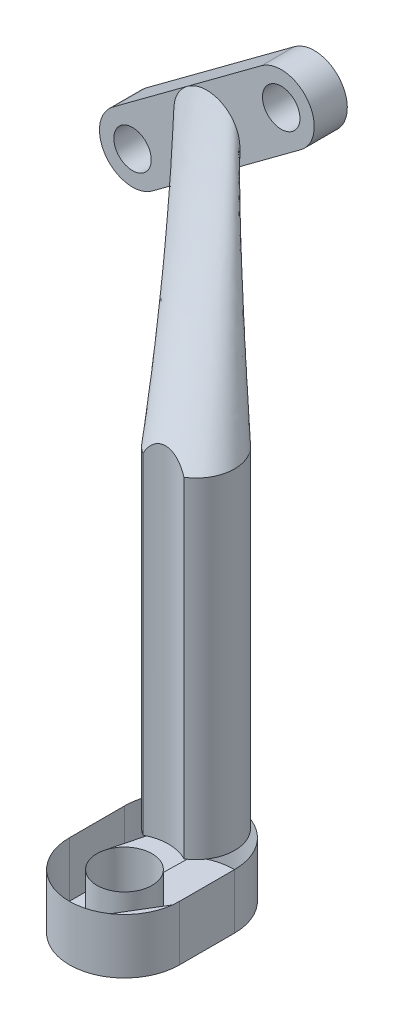
ISO-10303-21;
HEADER;
FILE_DESCRIPTION(('STEP AP214'),'2;1');
FILE_NAME('part.step','',(''),(''),'','','');
FILE_SCHEMA(('AUTOMOTIVE_DESIGN { 1 0 10303 214 1 1 1 1 }'));
ENDSEC;
DATA;
#1=APPLICATION_CONTEXT('core data for automotive mechanical design processes');
#2=APPLICATION_PROTOCOL_DEFINITION('international standard','automotive_design',2000,#1);
#3=PRODUCT_CONTEXT('',#1,'mechanical');
#4=PRODUCT('Part','Part','',(#3));
#5=PRODUCT_RELATED_PRODUCT_CATEGORY('part','',(#4));
#6=PRODUCT_DEFINITION_FORMATION('','',#4);
#7=PRODUCT_DEFINITION_CONTEXT('part definition',#1,'design');
#8=PRODUCT_DEFINITION('design','',#6,#7);
#9=PRODUCT_DEFINITION_SHAPE('','',#8);
#10=(LENGTH_UNIT() NAMED_UNIT(*) SI_UNIT(.MILLI.,.METRE.));
#11=(NAMED_UNIT(*) PLANE_ANGLE_UNIT() SI_UNIT($,.RADIAN.));
#12=(NAMED_UNIT(*) SI_UNIT($,.STERADIAN.) SOLID_ANGLE_UNIT());
#13=UNCERTAINTY_MEASURE_WITH_UNIT(LENGTH_MEASURE(1.E-05),#10,'distance_accuracy_value','');
#14=(GEOMETRIC_REPRESENTATION_CONTEXT(3) GLOBAL_UNCERTAINTY_ASSIGNED_CONTEXT((#13)) GLOBAL_UNIT_ASSIGNED_CONTEXT((#10,
#11,#12)) REPRESENTATION_CONTEXT('',''));
#15=CARTESIAN_POINT('',(0.,0.,0.));
#16=DIRECTION('',(0.,0.,1.));
#17=DIRECTION('',(1.,0.,0.));
#18=AXIS2_PLACEMENT_3D('',#15,#16,#17);
#19=CARTESIAN_POINT('',(0.,35.,-6.5));
#20=DIRECTION('',(0.,-1.,0.));
#21=DIRECTION('',(0.,0.,-1.));
#22=AXIS2_PLACEMENT_3D('',#19,#20,#21);
#23=CYLINDRICAL_SURFACE('',#22,3.5);
#24=DIRECTION('',(0.,-1.,0.));
#25=VECTOR('',#24,1.);
#26=CARTESIAN_POINT('',(-1.86528548507418,25.,-3.53846153846154));
#27=LINE('',#26,#25);
#28=CARTESIAN_POINT('',(-1.86532086672915,35.,-3.53844288912191));
#29=VERTEX_POINT('',#28);
#30=CARTESIAN_POINT('',(-1.86528548507417,5.,-3.53846153846154));
#31=VERTEX_POINT('',#30);
#32=EDGE_CURVE('E313',#29,#31,#27,.T.);
#33=ORIENTED_EDGE('',*,*,#32,.F.);
#34=CARTESIAN_POINT('',(0.,35.,-3.));
#35=CARTESIAN_POINT('',(0.291666666666667,35.,-3.));
#36=CARTESIAN_POINT('',(0.6216,35.,-3.03546666666667));
#37=CARTESIAN_POINT('',(1.3384,35.,-3.24453333333333));
#38=CARTESIAN_POINT('',(1.72666666666667,35.,-3.42));
#39=CARTESIAN_POINT('',(2.28666666666667,35.,-3.84));
#40=CARTESIAN_POINT('',(2.46884969037343,35.,-4.00597360355289));
#41=CARTESIAN_POINT('',(2.8051229123663,35.,-4.39128667041972));
#42=CARTESIAN_POINT('',(2.95905420991926,35.,-4.61072664359862));
#43=CARTESIAN_POINT('',(3.21741637831603,35.,-5.09515570934256));
#44=CARTESIAN_POINT('',(3.32161735700197,35.,-5.36011834319527));
#45=CARTESIAN_POINT('',(3.46299802761341,35.,-5.91680473372781));
#46=CARTESIAN_POINT('',(3.5,35.,-6.20833333333334));
#47=CARTESIAN_POINT('',(3.5,35.,-6.79166666666667));
#48=CARTESIAN_POINT('',(3.46299802761341,35.,-7.08319526627219));
#49=CARTESIAN_POINT('',(3.32161735700197,35.,-7.63988165680474));
#50=CARTESIAN_POINT('',(3.21741637831603,35.,-7.90484429065744));
#51=CARTESIAN_POINT('',(2.95905420991926,35.,-8.38927335640138));
#52=CARTESIAN_POINT('',(2.8051229123663,35.,-8.60871332958028));
#53=CARTESIAN_POINT('',(2.46884969037343,35.,-8.99402639644711));
#54=CARTESIAN_POINT('',(2.28666666666667,35.,-9.16));
#55=CARTESIAN_POINT('',(1.72666666666667,35.,-9.58));
#56=CARTESIAN_POINT('',(1.3384,35.,-9.75546666666667));
#57=CARTESIAN_POINT('',(0.6216,35.,-9.96453333333333));
#58=CARTESIAN_POINT('',(0.291666666666668,35.,-10.));
#59=CARTESIAN_POINT('',(-0.291666666666667,35.,-10.));
#60=CARTESIAN_POINT('',(-0.6216,35.,-9.96453333333334));
#61=CARTESIAN_POINT('',(-1.3384,35.,-9.75546666666667));
#62=CARTESIAN_POINT('',(-1.72666666666667,35.,-9.58000000000001));
#63=CARTESIAN_POINT('',(-2.28666666666667,35.,-9.16));
#64=CARTESIAN_POINT('',(-2.46884969037343,35.,-8.99402639644711));
#65=CARTESIAN_POINT('',(-2.8051229123663,35.,-8.60871332958028));
#66=CARTESIAN_POINT('',(-2.95905420991926,35.,-8.38927335640138));
#67=CARTESIAN_POINT('',(-3.21741637831603,35.,-7.90484429065744));
#68=CARTESIAN_POINT('',(-3.32161735700197,35.,-7.63988165680473));
#69=CARTESIAN_POINT('',(-3.46299802761341,35.,-7.08319526627219));
#70=CARTESIAN_POINT('',(-3.5,35.,-6.79166666666666));
#71=CARTESIAN_POINT('',(-3.5,35.,-6.20833333333333));
#72=CARTESIAN_POINT('',(-3.46299802761341,35.,-5.91680473372781));
#73=CARTESIAN_POINT('',(-3.32161735700197,35.,-5.36011834319527));
#74=CARTESIAN_POINT('',(-3.21741637831603,35.,-5.09515570934256));
#75=CARTESIAN_POINT('',(-2.95905420991926,35.,-4.61072664359862));
#76=CARTESIAN_POINT('',(-2.8051229123663,35.,-4.39128667041972));
#77=CARTESIAN_POINT('',(-2.46884969037343,35.,-4.00597360355289));
#78=CARTESIAN_POINT('',(-2.28666666666667,35.,-3.84));
#79=CARTESIAN_POINT('',(-1.72666666666667,35.,-3.42));
#80=CARTESIAN_POINT('',(-1.3384,35.,-3.24453333333334));
#81=CARTESIAN_POINT('',(-0.621600000000001,35.,-3.03546666666667));
#82=CARTESIAN_POINT('',(-0.291666666666666,35.,-3.));
#83=CARTESIAN_POINT('',(0.,35.,-3.));
#84=B_SPLINE_CURVE_WITH_KNOTS('',3,(#34,#35,#36,#37,#38,#39,#40,#41,#42,#43,#44,#45,#46,#47,#48,
#49,#50,#51,#52,#53,#54,#55,#56,#57,#58,#59,#60,#61,#62,#63,#64,#65,#66,#67,#68,#69,#70,#71,#72,
#73,#74,#75,#76,#77,#78,#79,#80,#81,#82,#83),.UNSPECIFIED.,.T.,.F.,(4,2,2,2,2,2,2,2,2,2,2,2,2,2,
2,2,2,2,2,2,2,2,2,2,4),(0.,0.0625,0.125,0.15625,0.1875,0.21875,0.25,0.28125,0.3125,0.34375,
0.375,0.4375,0.5,0.5625,0.625,0.65625,0.6875,0.71875,0.75,0.78125,0.8125,0.84375,0.875,0.9375,
1.),.UNSPECIFIED.);
#85=CARTESIAN_POINT('',(1.86532086676843,35.,-3.53844288914666));
#86=VERTEX_POINT('',#85);
#87=EDGE_CURVE('E328',#86,#29,#84,.T.);
#88=ORIENTED_EDGE('',*,*,#87,.F.);
#89=DIRECTION('',(0.,-1.,0.));
#90=VECTOR('',#89,1.);
#91=CARTESIAN_POINT('',(1.86528548507418,25.,-3.53846153846154));
#92=LINE('',#91,#90);
#93=CARTESIAN_POINT('',(1.86528548507417,5.,-3.53846153846154));
#94=VERTEX_POINT('',#93);
#95=EDGE_CURVE('E82',#94,#86,#92,.F.);
#96=ORIENTED_EDGE('',*,*,#95,.F.);
#97=CARTESIAN_POINT('',(0.,5.,-6.5));
#98=DIRECTION('',(0.,1.,0.));
#99=DIRECTION('',(0.,0.,1.));
#100=AXIS2_PLACEMENT_3D('',#97,#98,#99);
#101=CIRCLE('',#100,3.5);
#102=CARTESIAN_POINT('',(0.,5.,-10.));
#103=VERTEX_POINT('',#102);
#104=EDGE_CURVE('E316',#94,#103,#101,.T.);
#105=ORIENTED_EDGE('',*,*,#104,.T.);
#106=EDGE_CURVE('E346',#103,#31,#101,.T.);
#107=ORIENTED_EDGE('',*,*,#106,.T.);
#108=EDGE_LOOP('',(#33,#88,#96,#105,#107));
#109=FACE_BOUND('',#108,.T.);
#110=ADVANCED_FACE('F55',(#109),#23,.T.);
#111=CARTESIAN_POINT('',(0.,35.,-3.));
#112=CARTESIAN_POINT('',(-11.6185601313651,51.0029362070885,-16.1));
#113=CARTESIAN_POINT('',(0.291666666666667,35.,-3.));
#114=CARTESIAN_POINT('',(-11.610815447441,51.2528162180356,-16.1));
#115=CARTESIAN_POINT('',(0.6216,35.,-3.03546666666667));
#116=CARTESIAN_POINT('',(-11.571669251655,51.5345387328538,-16.1));
#117=CARTESIAN_POINT('',(1.3384,35.,-3.24453333333333));
#118=CARTESIAN_POINT('',(-11.3735219245964,52.1430924583206,-16.1));
#119=CARTESIAN_POINT('',(1.72666666666667,35.,-3.42));
#120=CARTESIAN_POINT('',(-11.2128843867709,52.4710735270447,-16.1));
#121=CARTESIAN_POINT('',(2.28666666666667,35.,-3.84));
#122=CARTESIAN_POINT('',(-10.838187377873,52.9396908032125,-16.1));
#123=CARTESIAN_POINT('',(2.46884969037343,35.,-4.00597360355289));
#124=CARTESIAN_POINT('',(-10.6911550265324,53.0913656015861,-16.1));
#125=CARTESIAN_POINT('',(2.8051229123663,35.,-4.39128667041972));
#126=CARTESIAN_POINT('',(-10.3521160670472,53.3692301563681,-16.1));
#127=CARTESIAN_POINT('',(2.95905420991926,35.,-4.61072664359862));
#128=CARTESIAN_POINT('',(-10.1600275682618,53.4952811086598,-16.1));
#129=CARTESIAN_POINT('',(3.21741637831603,35.,-5.09515570934256));
#130=CARTESIAN_POINT('',(-9.7381416016903,53.7037649651266,-16.1));
#131=CARTESIAN_POINT('',(3.32161735700197,35.,-5.36011834319527));
#132=CARTESIAN_POINT('',(-9.50837290628853,53.7860016160198,-16.1));
#133=CARTESIAN_POINT('',(3.46299802761341,35.,-5.91680473372781));
#134=CARTESIAN_POINT('',(-9.02768804925806,53.8923450790391,-16.1));
#135=CARTESIAN_POINT('',(3.5,35.,-6.20833333333334));
#136=CARTESIAN_POINT('',(-8.77694380385857,53.9163048152891,-16.1));
#137=CARTESIAN_POINT('',(3.5,35.,-6.79166666666667));
#138=CARTESIAN_POINT('',(-8.27718378196439,53.900815447441,-16.1));
#139=CARTESIAN_POINT('',(3.46299802761341,35.,-7.08319526627219));
#140=CARTESIAN_POINT('',(-8.02840457826114,53.8613736755881,-16.1));
#141=CARTESIAN_POINT('',(3.32161735700197,35.,-7.63988165680474));
#142=CARTESIAN_POINT('',(-7.55522794024909,53.7254666001838,-16.1));
#143=CARTESIAN_POINT('',(3.21741637831603,35.,-7.90484429065744));
#144=CARTESIAN_POINT('',(-7.33099298412389,53.6291587365988,-16.1));
#145=CARTESIAN_POINT('',(2.95905420991926,35.,-8.38927335640138));
#146=CARTESIAN_POINT('',(-6.92282770325867,53.3949485944327,-16.1));
#147=CARTESIAN_POINT('',(2.8051229123663,35.,-8.60871332958028));
#148=CARTESIAN_POINT('',(-6.73891394215716,53.2572439742605,-16.1));
#149=CARTESIAN_POINT('',(2.46884969037343,35.,-8.99402639644711));
#150=CARTESIAN_POINT('',(-6.41773324427047,52.9589168280635,-16.1));
#151=CARTESIAN_POINT('',(2.28666666666667,35.,-9.16));
#152=CARTESIAN_POINT('',(-6.28037597819806,52.7984277684379,-16.1));
#153=CARTESIAN_POINT('',(1.72666666666667,35.,-9.58));
#154=CARTESIAN_POINT('',(-5.93541855556842,52.3075058025689,-16.1));
#155=CARTESIAN_POINT('',(1.3384,35.,-9.75546666666667));
#156=CARTESIAN_POINT('',(-5.79540046422234,51.9702063301474,-16.1));
#157=CARTESIAN_POINT('',(0.6216,35.,-9.96453333333333));
#158=CARTESIAN_POINT('',(-5.63531980758719,51.3505498258071,-16.1));
#159=CARTESIAN_POINT('',(0.291666666666668,35.,-10.));
#160=CARTESIAN_POINT('',(-5.6136951847109,51.0669438038586,-16.1));
#161=CARTESIAN_POINT('',(-0.291666666666667,35.,-10.));
#162=CARTESIAN_POINT('',(-5.62918455255899,50.5671837819644,-16.1));
#163=CARTESIAN_POINT('',(-0.6216,35.,-9.96453333333334));
#164=CARTESIAN_POINT('',(-5.66833074834504,50.2854612671462,-16.1));
#165=CARTESIAN_POINT('',(-1.3384,35.,-9.75546666666667));
#166=CARTESIAN_POINT('',(-5.86647807540364,49.6769075416794,-16.1));
#167=CARTESIAN_POINT('',(-1.72666666666667,35.,-9.58000000000001));
#168=CARTESIAN_POINT('',(-6.02711561322909,49.3489264729553,-16.1));
#169=CARTESIAN_POINT('',(-2.28666666666667,35.,-9.16));
#170=CARTESIAN_POINT('',(-6.40181262212706,48.8803091967875,-16.1));
#171=CARTESIAN_POINT('',(-2.46884969037343,35.,-8.99402639644711));
#172=CARTESIAN_POINT('',(-6.54884497346761,48.728634398414,-16.1));
#173=CARTESIAN_POINT('',(-2.8051229123663,35.,-8.60871332958028));
#174=CARTESIAN_POINT('',(-6.88788393295284,48.4507698436319,-16.1));
#175=CARTESIAN_POINT('',(-2.95905420991926,35.,-8.38927335640138));
#176=CARTESIAN_POINT('',(-7.07997243173823,48.3247188913402,-16.1));
#177=CARTESIAN_POINT('',(-3.21741637831603,35.,-7.90484429065744));
#178=CARTESIAN_POINT('',(-7.50185839830971,48.1162350348734,-16.1));
#179=CARTESIAN_POINT('',(-3.32161735700197,35.,-7.63988165680473));
#180=CARTESIAN_POINT('',(-7.73162709371148,48.0339983839801,-16.1));
#181=CARTESIAN_POINT('',(-3.46299802761341,35.,-7.08319526627219));
#182=CARTESIAN_POINT('',(-8.21231195074195,47.9276549209609,-16.1));
#183=CARTESIAN_POINT('',(-3.5,35.,-6.79166666666666));
#184=CARTESIAN_POINT('',(-8.46305619614144,47.9036951847109,-16.1));
#185=CARTESIAN_POINT('',(-3.5,35.,-6.20833333333333));
#186=CARTESIAN_POINT('',(-8.96281621803562,47.919184552559,-16.1));
#187=CARTESIAN_POINT('',(-3.46299802761341,35.,-5.91680473372781));
#188=CARTESIAN_POINT('',(-9.21159542173888,47.958626324412,-16.1));
#189=CARTESIAN_POINT('',(-3.32161735700197,35.,-5.36011834319527));
#190=CARTESIAN_POINT('',(-9.68477205975091,48.0945333998163,-16.1));
#191=CARTESIAN_POINT('',(-3.21741637831603,35.,-5.09515570934256));
#192=CARTESIAN_POINT('',(-9.90900701587612,48.1908412634012,-16.1));
#193=CARTESIAN_POINT('',(-2.95905420991926,35.,-4.61072664359862));
#194=CARTESIAN_POINT('',(-10.3171722967413,48.4250514055673,-16.1));
#195=CARTESIAN_POINT('',(-2.8051229123663,35.,-4.39128667041972));
#196=CARTESIAN_POINT('',(-10.5010860578428,48.5627560257394,-16.1));
#197=CARTESIAN_POINT('',(-2.46884969037343,35.,-4.00597360355289));
#198=CARTESIAN_POINT('',(-10.8222667557295,48.8610831719365,-16.1));
#199=CARTESIAN_POINT('',(-2.28666666666667,35.,-3.84));
#200=CARTESIAN_POINT('',(-10.959624021802,49.0215722315621,-16.1));
#201=CARTESIAN_POINT('',(-1.72666666666667,35.,-3.42));
#202=CARTESIAN_POINT('',(-11.3045814444316,49.5124941974311,-16.1));
#203=CARTESIAN_POINT('',(-1.3384,35.,-3.24453333333334));
#204=CARTESIAN_POINT('',(-11.4445995357777,49.8497936698526,-16.1));
#205=CARTESIAN_POINT('',(-0.621600000000001,35.,-3.03546666666667));
#206=CARTESIAN_POINT('',(-11.6046801924128,50.4694501741929,-16.1));
#207=CARTESIAN_POINT('',(-0.291666666666666,35.,-3.));
#208=CARTESIAN_POINT('',(-11.6263048152891,50.7530561961414,-16.1));
#209=CARTESIAN_POINT('',(0.,35.,-3.));
#210=CARTESIAN_POINT('',(-11.6185601313651,51.0029362070885,-16.1));
#211=B_SPLINE_SURFACE_WITH_KNOTS('',3,1,((#111,#112),(#113,#114),(#115,#116),(#117,#118),(#119,
#120),(#121,#122),(#123,#124),(#125,#126),(#127,#128),(#129,#130),(#131,#132),(#133,#134),(#135,
#136),(#137,#138),(#139,#140),(#141,#142),(#143,#144),(#145,#146),(#147,#148),(#149,#150),(#151,
#152),(#153,#154),(#155,#156),(#157,#158),(#159,#160),(#161,#162),(#163,#164),(#165,#166),(#167,
#168),(#169,#170),(#171,#172),(#173,#174),(#175,#176),(#177,#178),(#179,#180),(#181,#182),(#183,
#184),(#185,#186),(#187,#188),(#189,#190),(#191,#192),(#193,#194),(#195,#196),(#197,#198),(#199,
#200),(#201,#202),(#203,#204),(#205,#206),(#207,#208),(#209,#210)),.UNSPECIFIED.,.T.,.F.,.F.,(4,
2,2,2,2,2,2,2,2,2,2,2,2,2,2,2,2,2,2,2,2,2,2,2,4),(2,2),(0.,0.0625,0.125,0.15625,0.1875,0.21875,
0.25,0.28125,0.3125,0.34375,0.375,0.4375,0.5,0.5625,0.625,0.65625,0.6875,0.71875,0.75,0.78125,
0.8125,0.84375,0.875,0.9375,1.),(0.,1.),.UNSPECIFIED.);
#212=CARTESIAN_POINT('',(-8.62,50.91,-16.1));
#213=DIRECTION('',(0.,0.,1.));
#214=DIRECTION('',(1.,0.,0.));
#215=AXIS2_PLACEMENT_3D('',#212,#213,#214);
#216=CIRCLE('',#215,3.);
#217=CARTESIAN_POINT('',(-6.83378720577725,48.4997211336569,-16.1));
#218=VERTEX_POINT('',#217);
#219=CARTESIAN_POINT('',(-10.4062090357818,53.3202737922608,-16.1));
#220=VERTEX_POINT('',#219);
#221=EDGE_CURVE('E310',#218,#220,#216,.T.);
#222=EDGE_CURVE('E59',#220,#218,#216,.T.);
#223=CARTESIAN_POINT('',(-1.86533265711893,35.,-3.53843667150984));
#224=CARTESIAN_POINT('',(-1.84430415537738,35.0524513896052,-3.54951496392083));
#225=CARTESIAN_POINT('',(-1.8218600702819,35.104249594314,-3.56111389749403));
#226=CARTESIAN_POINT('',(-1.77387964082151,35.2062613666845,-3.58525972649172));
#227=CARTESIAN_POINT('',(-1.74833869385888,35.2564724323827,-3.59780802220133));
#228=CARTESIAN_POINT('',(-1.6936623133287,35.3554201023944,-3.62386969813844));
#229=CARTESIAN_POINT('',(-1.66448998427255,35.4041340307208,-3.6373922772733));
#230=CARTESIAN_POINT('',(-1.60257078466286,35.4990137775839,-3.66509455467985));
#231=CARTESIAN_POINT('',(-1.56982599376761,35.5451810552966,-3.67927386790539));
#232=CARTESIAN_POINT('',(-1.50781226699224,35.6250506454661,-3.70504775060508));
#233=CARTESIAN_POINT('',(-1.47925760716478,35.6593345156345,-3.71655975596984));
#234=CARTESIAN_POINT('',(-1.41971161002791,35.7256980223915,-3.73971126104734));
#235=CARTESIAN_POINT('',(-1.38871965571388,35.7577770969563,-3.75135079239747));
#236=CARTESIAN_POINT('',(-1.32434519041882,35.8192516900621,-3.77455640586613));
#237=CARTESIAN_POINT('',(-1.29097064761831,35.8486554684897,-3.78612260383297));
#238=CARTESIAN_POINT('',(-1.22174986279285,35.9044641523128,-3.80902292721798));
#239=CARTESIAN_POINT('',(-1.18590494614898,35.93087064596,-3.82035717291212));
#240=CARTESIAN_POINT('',(-1.11135204368374,35.9806120744324,-3.84271078080183));
#241=CARTESIAN_POINT('',(-1.07261417095346,36.0039050570327,-3.85372452691405));
#242=CARTESIAN_POINT('',(-0.992903575425067,36.0466584868295,-3.87502934685887));
#243=CARTESIAN_POINT('',(-0.951930687197579,36.0661186498389,-3.88532036706808));
#244=CARTESIAN_POINT('',(-0.826139713144001,36.1183413414435,-3.91469599030313));
#245=CARTESIAN_POINT('',(-0.738323410939431,36.1450308185847,-3.93232213826651));
#246=CARTESIAN_POINT('',(-0.571141171748283,36.1782605875123,-3.9597916444242));
#247=CARTESIAN_POINT('',(-0.492338181374223,36.1871179076596,-3.97038341922915));
#248=CARTESIAN_POINT('',(-0.333845632098012,36.1924984410284,-3.98684099071458));
#249=CARTESIAN_POINT('',(-0.25415575054054,36.1890170087144,-3.99270500637536));
#250=CARTESIAN_POINT('',(-0.0691555295051705,36.168411651887,-4.00080337327573));
#251=CARTESIAN_POINT('',(0.0357527576907838,36.1470912908867,-4.00115238143022));
#252=CARTESIAN_POINT('',(0.24127689916579,36.0899478342684,-3.99404960829693));
#253=CARTESIAN_POINT('',(0.341882195616074,36.0540911024196,-3.98657967061534));
#254=CARTESIAN_POINT('',(0.518715438214504,35.9796976626228,-3.96701923496096));
#255=CARTESIAN_POINT('',(0.595887435599996,35.9430289853671,-3.956105634935));
#256=CARTESIAN_POINT('',(0.746793482888524,35.864288518912,-3.93041501463471));
#257=CARTESIAN_POINT('',(0.820525086247697,35.8222129622325,-3.91563529296297));
#258=CARTESIAN_POINT('',(0.964837242294723,35.733744578083,-3.88260049571982));
#259=CARTESIAN_POINT('',(1.03540722646218,35.6873386684063,-3.86433470264086));
#260=CARTESIAN_POINT('',(1.17332420257592,35.5912561411242,-3.82471631008257));
#261=CARTESIAN_POINT('',(1.24067211955815,35.5415804720959,-3.80336460371487));
#262=CARTESIAN_POINT('',(1.4065505509607,35.4132111976524,-3.74604096340282));
#263=CARTESIAN_POINT('',(1.50314361931317,35.3328265114293,-3.70822861556406));
#264=CARTESIAN_POINT('',(1.64288018322878,35.2095644828828,-3.64739457347784));
#265=CARTESIAN_POINT('',(1.68838911852607,35.1682390518429,-3.62654295139362));
#266=CARTESIAN_POINT('',(1.77793935194773,35.0847298384587,-3.58348942977258));
#267=CARTESIAN_POINT('',(1.82198094723,35.0425462327289,-3.56128780623551));
#268=CARTESIAN_POINT('',(1.86533265711893,35.,-3.53843667150984));
#269=B_SPLINE_CURVE_WITH_KNOTS('',3,(#223,#224,#225,#226,#227,#228,#229,#230,#231,#232,#233,
#234,#235,#236,#237,#238,#239,#240,#241,#242,#243,#244,#245,#246,#247,#248,#249,#250,#251,#252,
#253,#254,#255,#256,#257,#258,#259,#260,#261,#262,#263,#264,#265,#266,#267,#268),.UNSPECIFIED.,
.F.,.F.,(4,2,2,2,2,2,2,2,2,2,2,2,2,2,2,2,2,2,2,2,2,2,4),(0.,0.172766013510427,0.345792016106241,
0.520746816903737,0.695600308252288,0.833731838722696,0.971898450654548,1.10962287384091,
1.2472739731815,1.38662472680265,1.52598580879548,1.80424579241624,2.04312531615477,
2.28209478749736,2.60147639205628,2.92160128221552,3.17964874005256,3.43787698875668,
3.69691230453671,3.95587280101031,4.34910201919332,4.5438133783209,4.73848506284738),.UNSPECIFIED.);
#270=EDGE_CURVE('E12',#29,#86,#269,.T.);
#271=ORIENTED_EDGE('',*,*,#221,.T.);
#272=ORIENTED_EDGE('',*,*,#222,.T.);
#273=EDGE_LOOP('',(#271,#272));
#274=FACE_BOUND('',#273,.T.);
#275=ORIENTED_EDGE('',*,*,#87,.T.);
#276=ORIENTED_EDGE('',*,*,#270,.T.);
#277=EDGE_LOOP('',(#275,#276));
#278=FACE_BOUND('',#277,.T.);
#279=ADVANCED_FACE('F255',(#274,#278),#211,.T.);
#280=CARTESIAN_POINT('',(0.,5.,0.));
#281=DIRECTION('',(0.,-1.,0.));
#282=DIRECTION('',(0.,0.,-1.));
#283=AXIS2_PLACEMENT_3D('',#280,#281,#282);
#284=CYLINDRICAL_SURFACE('',#283,5.);
#285=CARTESIAN_POINT('',(0.,0.,0.));
#286=DIRECTION('',(0.,1.,0.));
#287=DIRECTION('',(0.,0.,1.));
#288=AXIS2_PLACEMENT_3D('',#285,#286,#287);
#289=CIRCLE('',#288,5.);
#290=CARTESIAN_POINT('',(-5.,0.,0.));
#291=VERTEX_POINT('',#290);
#292=CARTESIAN_POINT('',(5.,0.,0.));
#293=VERTEX_POINT('',#292);
#294=EDGE_CURVE('E373',#291,#293,#289,.T.);
#295=ORIENTED_EDGE('',*,*,#294,.T.);
#296=DIRECTION('',(0.,-1.,0.));
#297=VECTOR('',#296,1.);
#298=CARTESIAN_POINT('',(5.,5.,0.));
#299=LINE('',#298,#297);
#300=CARTESIAN_POINT('',(5.,5.,0.));
#301=VERTEX_POINT('',#300);
#302=EDGE_CURVE('E66',#301,#293,#299,.T.);
#303=ORIENTED_EDGE('',*,*,#302,.F.);
#304=CARTESIAN_POINT('',(0.,5.,0.));
#305=DIRECTION('',(0.,1.,0.));
#306=DIRECTION('',(0.,0.,1.));
#307=AXIS2_PLACEMENT_3D('',#304,#305,#306);
#308=CIRCLE('',#307,5.);
#309=CARTESIAN_POINT('',(-5.,5.,0.));
#310=VERTEX_POINT('',#309);
#311=EDGE_CURVE('E356',#310,#301,#308,.T.);
#312=ORIENTED_EDGE('',*,*,#311,.F.);
#313=DIRECTION('',(0.,-1.,0.));
#314=VECTOR('',#313,1.);
#315=CARTESIAN_POINT('',(-5.,5.,0.));
#316=LINE('',#315,#314);
#317=EDGE_CURVE('E372',#310,#291,#316,.T.);
#318=ORIENTED_EDGE('',*,*,#317,.T.);
#319=EDGE_LOOP('',(#295,#303,#312,#318));
#320=FACE_BOUND('',#319,.T.);
#321=ADVANCED_FACE('F57',(#320),#284,.T.);
#322=CARTESIAN_POINT('',(5.,5.,0.));
#323=DIRECTION('',(-1.,0.,0.));
#324=DIRECTION('',(0.,0.,1.));
#325=AXIS2_PLACEMENT_3D('',#322,#323,#324);
#326=PLANE('',#325);
#327=DIRECTION('',(0.,0.,-1.));
#328=VECTOR('',#327,1.);
#329=CARTESIAN_POINT('',(5.,0.,0.));
#330=LINE('',#329,#328);
#331=CARTESIAN_POINT('',(5.,0.,-5.));
#332=VERTEX_POINT('',#331);
#333=EDGE_CURVE('E377',#293,#332,#330,.T.);
#334=ORIENTED_EDGE('',*,*,#333,.T.);
#335=DIRECTION('',(0.,-1.,0.));
#336=VECTOR('',#335,1.);
#337=CARTESIAN_POINT('',(5.,5.,-5.));
#338=LINE('',#337,#336);
#339=CARTESIAN_POINT('',(5.,5.,-5.));
#340=VERTEX_POINT('',#339);
#341=EDGE_CURVE('E392',#340,#332,#338,.T.);
#342=ORIENTED_EDGE('',*,*,#341,.F.);
#343=DIRECTION('',(0.,0.,-1.));
#344=VECTOR('',#343,1.);
#345=CARTESIAN_POINT('',(5.,5.,0.));
#346=LINE('',#345,#344);
#347=EDGE_CURVE('E360',#301,#340,#346,.T.);
#348=ORIENTED_EDGE('',*,*,#347,.F.);
#349=ORIENTED_EDGE('',*,*,#302,.T.);
#350=EDGE_LOOP('',(#334,#342,#348,#349));
#351=FACE_BOUND('',#350,.T.);
#352=ADVANCED_FACE('F426',(#351),#326,.F.);
#353=CARTESIAN_POINT('',(0.,5.,-5.));
#354=DIRECTION('',(0.,-1.,0.));
#355=DIRECTION('',(0.,0.,-1.));
#356=AXIS2_PLACEMENT_3D('',#353,#354,#355);
#357=CYLINDRICAL_SURFACE('',#356,5.);
#358=CARTESIAN_POINT('',(0.,0.,-5.));
#359=DIRECTION('',(0.,1.,0.));
#360=DIRECTION('',(0.,0.,1.));
#361=AXIS2_PLACEMENT_3D('',#358,#359,#360);
#362=CIRCLE('',#361,5.);
#363=CARTESIAN_POINT('',(-5.,0.,-5.));
#364=VERTEX_POINT('',#363);
#365=EDGE_CURVE('E380',#332,#364,#362,.T.);
#366=ORIENTED_EDGE('',*,*,#365,.T.);
#367=DIRECTION('',(0.,-1.,0.));
#368=VECTOR('',#367,1.);
#369=CARTESIAN_POINT('',(-5.,5.,-5.));
#370=LINE('',#369,#368);
#371=CARTESIAN_POINT('',(-5.,5.,-5.));
#372=VERTEX_POINT('',#371);
#373=EDGE_CURVE('E388',#372,#364,#370,.T.);
#374=ORIENTED_EDGE('',*,*,#373,.F.);
#375=CARTESIAN_POINT('',(0.,5.,-5.));
#376=DIRECTION('',(0.,1.,0.));
#377=DIRECTION('',(0.,0.,1.));
#378=AXIS2_PLACEMENT_3D('',#375,#376,#377);
#379=CIRCLE('',#378,5.);
#380=EDGE_CURVE('E364',#103,#372,#379,.T.);
#381=ORIENTED_EDGE('',*,*,#380,.F.);
#382=EDGE_CURVE('E365',#340,#103,#379,.T.);
#383=ORIENTED_EDGE('',*,*,#382,.F.);
#384=ORIENTED_EDGE('',*,*,#341,.T.);
#385=EDGE_LOOP('',(#366,#374,#381,#383,#384));
#386=FACE_BOUND('',#385,.T.);
#387=ADVANCED_FACE('F420',(#386),#357,.T.);
#388=CARTESIAN_POINT('',(-5.,5.,0.));
#389=DIRECTION('',(1.,0.,0.));
#390=DIRECTION('',(0.,0.,-1.));
#391=AXIS2_PLACEMENT_3D('',#388,#389,#390);
#392=PLANE('',#391);
#393=DIRECTION('',(0.,0.,1.));
#394=VECTOR('',#393,1.);
#395=CARTESIAN_POINT('',(-5.,0.,0.));
#396=LINE('',#395,#394);
#397=EDGE_CURVE('E361',#364,#291,#396,.T.);
#398=ORIENTED_EDGE('',*,*,#397,.T.);
#399=ORIENTED_EDGE('',*,*,#317,.F.);
#400=DIRECTION('',(0.,0.,1.));
#401=VECTOR('',#400,1.);
#402=CARTESIAN_POINT('',(-5.,5.,0.));
#403=LINE('',#402,#401);
#404=EDGE_CURVE('E369',#372,#310,#403,.T.);
#405=ORIENTED_EDGE('',*,*,#404,.F.);
#406=ORIENTED_EDGE('',*,*,#373,.T.);
#407=EDGE_LOOP('',(#398,#399,#405,#406));
#408=FACE_BOUND('',#407,.T.);
#409=ADVANCED_FACE('F415',(#408),#392,.F.);
#410=CARTESIAN_POINT('',(0.,5.,0.));
#411=DIRECTION('',(0.,1.,0.));
#412=DIRECTION('',(0.,0.,1.));
#413=AXIS2_PLACEMENT_3D('',#410,#411,#412);
#414=PLANE('',#413);
#415=ORIENTED_EDGE('',*,*,#104,.F.);
#416=CARTESIAN_POINT('',(0.,5.,0.));
#417=DIRECTION('',(0.,1.,0.));
#418=DIRECTION('',(0.,0.,1.));
#419=AXIS2_PLACEMENT_3D('',#416,#417,#418);
#420=CIRCLE('',#419,4.);
#421=EDGE_CURVE('E206',#94,#31,#420,.T.);
#422=ORIENTED_EDGE('',*,*,#421,.T.);
#423=ORIENTED_EDGE('',*,*,#106,.F.);
#424=ORIENTED_EDGE('',*,*,#380,.T.);
#425=ORIENTED_EDGE('',*,*,#404,.T.);
#426=ORIENTED_EDGE('',*,*,#311,.T.);
#427=ORIENTED_EDGE('',*,*,#347,.T.);
#428=ORIENTED_EDGE('',*,*,#382,.T.);
#429=EDGE_LOOP('',(#415,#422,#423,#424,#425,#426,#427,#428));
#430=FACE_BOUND('',#429,.T.);
#431=CARTESIAN_POINT('',(0.,5.,0.));
#432=DIRECTION('',(0.,1.,0.));
#433=DIRECTION('',(0.,0.,1.));
#434=AXIS2_PLACEMENT_3D('',#431,#432,#433);
#435=CIRCLE('',#434,2.5);
#436=CARTESIAN_POINT('',(0.,5.,2.5));
#437=VERTEX_POINT('',#436);
#438=EDGE_CURVE('E351',#437,#437,#435,.T.);
#439=ORIENTED_EDGE('',*,*,#438,.F.);
#440=EDGE_LOOP('',(#439));
#441=FACE_BOUND('',#440,.T.);
#442=ADVANCED_FACE('F410',(#430,#441),#414,.T.);
#443=CARTESIAN_POINT('',(0.,0.,0.));
#444=DIRECTION('',(0.,1.,0.));
#445=DIRECTION('',(0.,0.,1.));
#446=AXIS2_PLACEMENT_3D('',#443,#444,#445);
#447=PLANE('',#446);
#448=CARTESIAN_POINT('',(0.,0.,0.));
#449=DIRECTION('',(0.,1.,0.));
#450=DIRECTION('',(0.,0.,1.));
#451=AXIS2_PLACEMENT_3D('',#448,#449,#450);
#452=CIRCLE('',#451,2.5);
#453=CARTESIAN_POINT('',(0.,0.,2.5));
#454=VERTEX_POINT('',#453);
#455=EDGE_CURVE('E355',#454,#454,#452,.T.);
#456=ORIENTED_EDGE('',*,*,#455,.T.);
#457=EDGE_LOOP('',(#456));
#458=FACE_BOUND('',#457,.T.);
#459=ORIENTED_EDGE('',*,*,#294,.F.);
#460=ORIENTED_EDGE('',*,*,#397,.F.);
#461=ORIENTED_EDGE('',*,*,#365,.F.);
#462=ORIENTED_EDGE('',*,*,#333,.F.);
#463=EDGE_LOOP('',(#459,#460,#461,#462));
#464=FACE_BOUND('',#463,.T.);
#465=ADVANCED_FACE('F402',(#458,#464),#447,.F.);
#466=CARTESIAN_POINT('',(0.,-5.,0.));
#467=DIRECTION('',(0.,1.,0.));
#468=DIRECTION('',(0.,0.,1.));
#469=AXIS2_PLACEMENT_3D('',#466,#467,#468);
#470=CYLINDRICAL_SURFACE('',#469,2.5);
#471=ORIENTED_EDGE('',*,*,#438,.T.);
#472=EDGE_LOOP('',(#471));
#473=FACE_BOUND('',#472,.T.);
#474=ORIENTED_EDGE('',*,*,#455,.F.);
#475=EDGE_LOOP('',(#474));
#476=FACE_BOUND('',#475,.T.);
#477=ADVANCED_FACE('F271',(#473,#476),#470,.F.);
#478=CARTESIAN_POINT('',(0.,45.,0.));
#479=DIRECTION('',(0.,-1.,0.));
#480=DIRECTION('',(0.,0.,-1.));
#481=AXIS2_PLACEMENT_3D('',#478,#479,#480);
#482=CYLINDRICAL_SURFACE('',#481,4.);
#483=ORIENTED_EDGE('',*,*,#32,.T.);
#484=ORIENTED_EDGE('',*,*,#421,.F.);
#485=ORIENTED_EDGE('',*,*,#95,.T.);
#486=ORIENTED_EDGE('',*,*,#270,.F.);
#487=EDGE_LOOP('',(#483,#484,#485,#486));
#488=FACE_BOUND('',#487,.T.);
#489=ADVANCED_FACE('F252',(#488),#482,.F.);
#490=CARTESIAN_POINT('',(-1.87021946355573,55.9100462707697,-16.1));
#491=DIRECTION('',(0.,0.,1.));
#492=DIRECTION('',(1.,0.,0.));
#493=AXIS2_PLACEMENT_3D('',#490,#491,#492);
#494=PLANE('',#493);
#495=CARTESIAN_POINT('',(-15.3697805364443,45.9099537292303,-16.1));
#496=DIRECTION('',(0.,0.,1.));
#497=DIRECTION('',(1.,0.,0.));
#498=AXIS2_PLACEMENT_3D('',#495,#496,#497);
#499=CIRCLE('',#498,1.7);
#500=CARTESIAN_POINT('',(-13.6697805364443,45.9099537292303,-16.1));
#501=VERTEX_POINT('',#500);
#502=EDGE_CURVE('E178',#501,#501,#499,.T.);
#503=ORIENTED_EDGE('',*,*,#502,.F.);
#504=EDGE_LOOP('',(#503));
#505=FACE_BOUND('',#504,.T.);
#506=DIRECTION('',(0.803545301957652,0.59524360366306,0.));
#507=VECTOR('',#506,1.);
#508=CARTESIAN_POINT('',(-0.08448865256655,53.4994103648967,-16.1));
#509=LINE('',#508,#507);
#510=CARTESIAN_POINT('',(-13.5840497254551,43.4993178233573,-16.1));
#511=VERTEX_POINT('',#510);
#512=EDGE_CURVE('E171',#511,#218,#509,.T.);
#513=ORIENTED_EDGE('',*,*,#512,.T.);
#514=ORIENTED_EDGE('',*,*,#222,.F.);
#515=DIRECTION('',(-0.803545301957652,-0.59524360366306,0.));
#516=VECTOR('',#515,1.);
#517=CARTESIAN_POINT('',(-3.65595027454491,58.3206821766427,-16.1));
#518=LINE('',#517,#516);
#519=CARTESIAN_POINT('',(-17.1555113474335,48.3205896351032,-16.1));
#520=VERTEX_POINT('',#519);
#521=EDGE_CURVE('E188',#220,#520,#518,.T.);
#522=ORIENTED_EDGE('',*,*,#521,.T.);
#523=CARTESIAN_POINT('',(-15.3697805364443,45.9099537292303,-16.1));
#524=DIRECTION('',(0.,0.,1.));
#525=DIRECTION('',(1.,0.,0.));
#526=AXIS2_PLACEMENT_3D('',#523,#524,#525);
#527=CIRCLE('',#526,3.);
#528=EDGE_CURVE('E192',#520,#511,#527,.T.);
#529=ORIENTED_EDGE('',*,*,#528,.T.);
#530=EDGE_LOOP('',(#513,#514,#522,#529));
#531=FACE_BOUND('',#530,.T.);
#532=ADVANCED_FACE('F240',(#505,#531),#494,.T.);
#533=CARTESIAN_POINT('',(-1.87021946355573,55.9100462707697,-19.1));
#534=DIRECTION('',(0.,0.,1.));
#535=DIRECTION('',(1.,0.,0.));
#536=AXIS2_PLACEMENT_3D('',#533,#534,#535);
#537=CYLINDRICAL_SURFACE('',#536,3.);
#538=CARTESIAN_POINT('',(-1.87021946355573,55.9100462707697,-16.1));
#539=DIRECTION('',(0.,0.,1.));
#540=DIRECTION('',(1.,0.,0.));
#541=AXIS2_PLACEMENT_3D('',#538,#539,#540);
#542=CIRCLE('',#541,3.);
#543=CARTESIAN_POINT('',(-0.08448865256655,53.4994103648967,-16.1));
#544=VERTEX_POINT('',#543);
#545=CARTESIAN_POINT('',(-3.65595027454491,58.3206821766427,-16.1));
#546=VERTEX_POINT('',#545);
#547=EDGE_CURVE('E185',#544,#546,#542,.T.);
#548=ORIENTED_EDGE('',*,*,#547,.F.);
#549=DIRECTION('',(0.,0.,1.));
#550=VECTOR('',#549,1.);
#551=CARTESIAN_POINT('',(-0.08448865256655,53.4994103648967,-19.1));
#552=LINE('',#551,#550);
#553=CARTESIAN_POINT('',(-0.08448865256655,53.4994103648967,-19.1));
#554=VERTEX_POINT('',#553);
#555=EDGE_CURVE('E169',#554,#544,#552,.T.);
#556=ORIENTED_EDGE('',*,*,#555,.F.);
#557=CARTESIAN_POINT('',(-1.87021946355573,55.9100462707697,-19.1));
#558=DIRECTION('',(0.,0.,1.));
#559=DIRECTION('',(1.,0.,0.));
#560=AXIS2_PLACEMENT_3D('',#557,#558,#559);
#561=CIRCLE('',#560,3.);
#562=CARTESIAN_POINT('',(-3.65595027454491,58.3206821766427,-19.1));
#563=VERTEX_POINT('',#562);
#564=EDGE_CURVE('E161',#554,#563,#561,.T.);
#565=ORIENTED_EDGE('',*,*,#564,.T.);
#566=DIRECTION('',(0.,0.,1.));
#567=VECTOR('',#566,1.);
#568=CARTESIAN_POINT('',(-3.65595027454491,58.3206821766427,-19.1));
#569=LINE('',#568,#567);
#570=EDGE_CURVE('E144',#563,#546,#569,.T.);
#571=ORIENTED_EDGE('',*,*,#570,.T.);
#572=EDGE_LOOP('',(#548,#556,#565,#571));
#573=FACE_BOUND('',#572,.T.);
#574=ADVANCED_FACE('F167',(#573),#537,.T.);
#575=CARTESIAN_POINT('',(-0.08448865256655,53.4994103648967,-19.1));
#576=DIRECTION('',(0.59524360366306,-0.803545301957652,0.));
#577=DIRECTION('',(0.803545301957652,0.59524360366306,0.));
#578=AXIS2_PLACEMENT_3D('',#575,#576,#577);
#579=PLANE('',#578);
#580=ORIENTED_EDGE('',*,*,#512,.F.);
#581=DIRECTION('',(0.,0.,1.));
#582=VECTOR('',#581,1.);
#583=CARTESIAN_POINT('',(-13.5840497254551,43.4993178233573,-19.1));
#584=LINE('',#583,#582);
#585=CARTESIAN_POINT('',(-13.5840497254551,43.4993178233573,-19.1));
#586=VERTEX_POINT('',#585);
#587=EDGE_CURVE('E207',#586,#511,#584,.T.);
#588=ORIENTED_EDGE('',*,*,#587,.F.);
#589=DIRECTION('',(0.803545301957652,0.59524360366306,0.));
#590=VECTOR('',#589,1.);
#591=CARTESIAN_POINT('',(-0.08448865256655,53.4994103648967,-19.1));
#592=LINE('',#591,#590);
#593=EDGE_CURVE('E154',#586,#554,#592,.T.);
#594=ORIENTED_EDGE('',*,*,#593,.T.);
#595=ORIENTED_EDGE('',*,*,#555,.T.);
#596=EDGE_CURVE('E175',#218,#544,#509,.T.);
#597=ORIENTED_EDGE('',*,*,#596,.F.);
#598=EDGE_LOOP('',(#580,#588,#594,#595,#597));
#599=FACE_BOUND('',#598,.T.);
#600=ADVANCED_FACE('F298',(#599),#579,.T.);
#601=CARTESIAN_POINT('',(-15.3697805364443,45.9099537292303,-19.1));
#602=DIRECTION('',(0.,0.,1.));
#603=DIRECTION('',(1.,0.,0.));
#604=AXIS2_PLACEMENT_3D('',#601,#602,#603);
#605=CYLINDRICAL_SURFACE('',#604,3.);
#606=ORIENTED_EDGE('',*,*,#528,.F.);
#607=DIRECTION('',(0.,0.,1.));
#608=VECTOR('',#607,1.);
#609=CARTESIAN_POINT('',(-17.1555113474335,48.3205896351032,-19.1));
#610=LINE('',#609,#608);
#611=CARTESIAN_POINT('',(-17.1555113474335,48.3205896351032,-19.1));
#612=VERTEX_POINT('',#611);
#613=EDGE_CURVE('E153',#612,#520,#610,.T.);
#614=ORIENTED_EDGE('',*,*,#613,.F.);
#615=CARTESIAN_POINT('',(-15.3697805364443,45.9099537292303,-19.1));
#616=DIRECTION('',(0.,0.,1.));
#617=DIRECTION('',(1.,0.,0.));
#618=AXIS2_PLACEMENT_3D('',#615,#616,#617);
#619=CIRCLE('',#618,3.);
#620=EDGE_CURVE('E164',#612,#586,#619,.T.);
#621=ORIENTED_EDGE('',*,*,#620,.T.);
#622=ORIENTED_EDGE('',*,*,#587,.T.);
#623=EDGE_LOOP('',(#606,#614,#621,#622));
#624=FACE_BOUND('',#623,.T.);
#625=ADVANCED_FACE('F215',(#624),#605,.T.);
#626=CARTESIAN_POINT('',(-3.65595027454491,58.3206821766427,-19.1));
#627=DIRECTION('',(-0.59524360366306,0.803545301957652,0.));
#628=DIRECTION('',(-0.803545301957652,-0.59524360366306,0.));
#629=AXIS2_PLACEMENT_3D('',#626,#627,#628);
#630=PLANE('',#629);
#631=EDGE_CURVE('E74',#546,#220,#518,.T.);
#632=ORIENTED_EDGE('',*,*,#631,.F.);
#633=ORIENTED_EDGE('',*,*,#570,.F.);
#634=DIRECTION('',(-0.803545301957652,-0.59524360366306,0.));
#635=VECTOR('',#634,1.);
#636=CARTESIAN_POINT('',(-3.65595027454491,58.3206821766427,-19.1));
#637=LINE('',#636,#635);
#638=EDGE_CURVE('E148',#563,#612,#637,.T.);
#639=ORIENTED_EDGE('',*,*,#638,.T.);
#640=ORIENTED_EDGE('',*,*,#613,.T.);
#641=ORIENTED_EDGE('',*,*,#521,.F.);
#642=EDGE_LOOP('',(#632,#633,#639,#640,#641));
#643=FACE_BOUND('',#642,.T.);
#644=ADVANCED_FACE('F146',(#643),#630,.T.);
#645=CARTESIAN_POINT('',(-1.87021946355573,55.9100462707697,-19.1));
#646=DIRECTION('',(0.,0.,1.));
#647=DIRECTION('',(1.,0.,0.));
#648=AXIS2_PLACEMENT_3D('',#645,#646,#647);
#649=PLANE('',#648);
#650=CARTESIAN_POINT('',(-1.87021946355573,55.9100462707697,-19.1));
#651=DIRECTION('',(0.,0.,1.));
#652=DIRECTION('',(1.,0.,0.));
#653=AXIS2_PLACEMENT_3D('',#650,#651,#652);
#654=CIRCLE('',#653,1.7);
#655=CARTESIAN_POINT('',(-0.170219463555728,55.9100462707697,-19.1));
#656=VERTEX_POINT('',#655);
#657=EDGE_CURVE('E225',#656,#656,#654,.T.);
#658=ORIENTED_EDGE('',*,*,#657,.T.);
#659=EDGE_LOOP('',(#658));
#660=FACE_BOUND('',#659,.T.);
#661=CARTESIAN_POINT('',(-15.3697805364443,45.9099537292303,-19.1));
#662=DIRECTION('',(0.,0.,1.));
#663=DIRECTION('',(1.,0.,0.));
#664=AXIS2_PLACEMENT_3D('',#661,#662,#663);
#665=CIRCLE('',#664,1.7);
#666=CARTESIAN_POINT('',(-13.6697805364443,45.9099537292303,-19.1));
#667=VERTEX_POINT('',#666);
#668=EDGE_CURVE('E189',#667,#667,#665,.T.);
#669=ORIENTED_EDGE('',*,*,#668,.T.);
#670=EDGE_LOOP('',(#669));
#671=FACE_BOUND('',#670,.T.);
#672=ORIENTED_EDGE('',*,*,#564,.F.);
#673=ORIENTED_EDGE('',*,*,#593,.F.);
#674=ORIENTED_EDGE('',*,*,#620,.F.);
#675=ORIENTED_EDGE('',*,*,#638,.F.);
#676=EDGE_LOOP('',(#672,#673,#674,#675));
#677=FACE_BOUND('',#676,.T.);
#678=ADVANCED_FACE('F159',(#660,#671,#677),#649,.F.);
#679=CARTESIAN_POINT('',(-1.87021946355573,55.9100462707697,-16.1));
#680=DIRECTION('',(0.,0.,1.));
#681=DIRECTION('',(1.,0.,0.));
#682=AXIS2_PLACEMENT_3D('',#679,#680,#681);
#683=CIRCLE('',#682,1.7);
#684=CARTESIAN_POINT('',(-0.170219463555728,55.9100462707697,-16.1));
#685=VERTEX_POINT('',#684);
#686=EDGE_CURVE('E228',#685,#685,#683,.T.);
#687=ORIENTED_EDGE('',*,*,#686,.F.);
#688=EDGE_LOOP('',(#687));
#689=FACE_BOUND('',#688,.T.);
#690=ORIENTED_EDGE('',*,*,#631,.T.);
#691=ORIENTED_EDGE('',*,*,#221,.F.);
#692=ORIENTED_EDGE('',*,*,#596,.T.);
#693=ORIENTED_EDGE('',*,*,#547,.T.);
#694=EDGE_LOOP('',(#690,#691,#692,#693));
#695=FACE_BOUND('',#694,.T.);
#696=ADVANCED_FACE('F236',(#689,#695),#494,.T.);
#697=CARTESIAN_POINT('',(-15.3697805364443,45.9099537292303,-19.1));
#698=DIRECTION('',(0.,0.,1.));
#699=DIRECTION('',(1.,0.,0.));
#700=AXIS2_PLACEMENT_3D('',#697,#698,#699);
#701=CYLINDRICAL_SURFACE('',#700,1.7);
#702=ORIENTED_EDGE('',*,*,#668,.F.);
#703=EDGE_LOOP('',(#702));
#704=FACE_BOUND('',#703,.T.);
#705=ORIENTED_EDGE('',*,*,#502,.T.);
#706=EDGE_LOOP('',(#705));
#707=FACE_BOUND('',#706,.T.);
#708=ADVANCED_FACE('F238',(#704,#707),#701,.F.);
#709=CARTESIAN_POINT('',(-1.87021946355573,55.9100462707697,-19.1));
#710=DIRECTION('',(0.,0.,1.));
#711=DIRECTION('',(1.,0.,0.));
#712=AXIS2_PLACEMENT_3D('',#709,#710,#711);
#713=CYLINDRICAL_SURFACE('',#712,1.7);
#714=ORIENTED_EDGE('',*,*,#657,.F.);
#715=EDGE_LOOP('',(#714));
#716=FACE_BOUND('',#715,.T.);
#717=ORIENTED_EDGE('',*,*,#686,.T.);
#718=EDGE_LOOP('',(#717));
#719=FACE_BOUND('',#718,.T.);
#720=ADVANCED_FACE('F234',(#716,#719),#713,.F.);
#721=CLOSED_SHELL('',(#110,#279,#321,#352,#387,#409,#442,#465,#477,#489,#532,#574,#600,#625,
#644,#678,#696,#708,#720));
#722=MANIFOLD_SOLID_BREP('B2',#721);
#723=ADVANCED_BREP_SHAPE_REPRESENTATION('',(#18,#722),#14);
#724=SHAPE_DEFINITION_REPRESENTATION(#9,#723);
ENDSEC;
END-ISO-10303-21;
